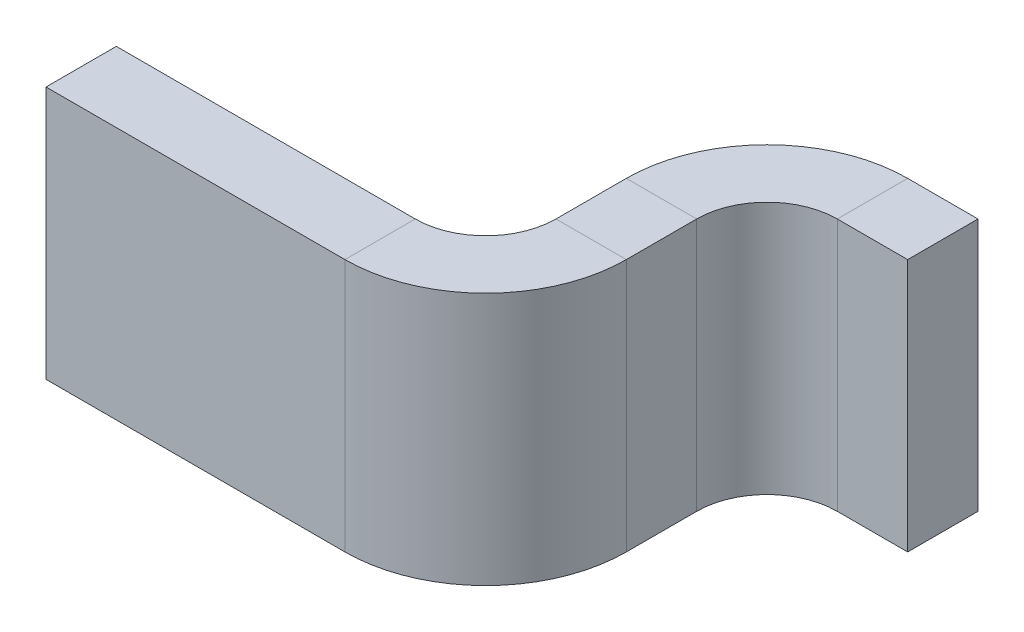
ISO-10303-21;
HEADER;
FILE_DESCRIPTION(('STEP AP214'),'2;1');
FILE_NAME('part.step','',(''),(''),'','','');
FILE_SCHEMA(('AUTOMOTIVE_DESIGN { 1 0 10303 214 1 1 1 1 }'));
ENDSEC;
DATA;
#1=APPLICATION_CONTEXT('core data for automotive mechanical design processes');
#2=APPLICATION_PROTOCOL_DEFINITION('international standard','automotive_design',2000,#1);
#3=PRODUCT_CONTEXT('',#1,'mechanical');
#4=PRODUCT('Part','Part','',(#3));
#5=PRODUCT_RELATED_PRODUCT_CATEGORY('part','',(#4));
#6=PRODUCT_DEFINITION_FORMATION('','',#4);
#7=PRODUCT_DEFINITION_CONTEXT('part definition',#1,'design');
#8=PRODUCT_DEFINITION('design','',#6,#7);
#9=PRODUCT_DEFINITION_SHAPE('','',#8);
#10=(LENGTH_UNIT() NAMED_UNIT(*) SI_UNIT(.MILLI.,.METRE.));
#11=(NAMED_UNIT(*) PLANE_ANGLE_UNIT() SI_UNIT($,.RADIAN.));
#12=(NAMED_UNIT(*) SI_UNIT($,.STERADIAN.) SOLID_ANGLE_UNIT());
#13=UNCERTAINTY_MEASURE_WITH_UNIT(LENGTH_MEASURE(1.E-05),#10,'distance_accuracy_value','');
#14=(GEOMETRIC_REPRESENTATION_CONTEXT(3) GLOBAL_UNCERTAINTY_ASSIGNED_CONTEXT((#13)) GLOBAL_UNIT_ASSIGNED_CONTEXT((#10,
#11,#12)) REPRESENTATION_CONTEXT('',''));
#15=CARTESIAN_POINT('',(0.,0.,0.));
#16=DIRECTION('',(0.,0.,1.));
#17=DIRECTION('',(1.,0.,0.));
#18=AXIS2_PLACEMENT_3D('',#15,#16,#17);
#19=CARTESIAN_POINT('',(1.65,-0.36,0.));
#20=DIRECTION('',(-1.,0.,0.));
#21=DIRECTION('',(0.,0.,1.));
#22=AXIS2_PLACEMENT_3D('',#19,#20,#21);
#23=PLANE('',#22);
#24=DIRECTION('',(0.,-1.,0.));
#25=VECTOR('',#24,1.);
#26=CARTESIAN_POINT('',(1.65,-0.36,0.));
#27=LINE('',#26,#25);
#28=CARTESIAN_POINT('',(1.65,0.36,0.));
#29=VERTEX_POINT('',#28);
#30=CARTESIAN_POINT('',(1.65,-0.36,0.));
#31=VERTEX_POINT('',#30);
#32=EDGE_CURVE('E185',#29,#31,#27,.T.);
#33=ORIENTED_EDGE('',*,*,#32,.F.);
#34=DIRECTION('',(0.,0.,-1.));
#35=VECTOR('',#34,1.);
#36=CARTESIAN_POINT('',(1.65,0.36,0.));
#37=LINE('',#36,#35);
#38=CARTESIAN_POINT('',(1.65,0.36,0.2));
#39=VERTEX_POINT('',#38);
#40=EDGE_CURVE('E11',#39,#29,#37,.T.);
#41=ORIENTED_EDGE('',*,*,#40,.F.);
#42=DIRECTION('',(0.,1.,0.));
#43=VECTOR('',#42,1.);
#44=CARTESIAN_POINT('',(1.65,0.36,0.2));
#45=LINE('',#44,#43);
#46=CARTESIAN_POINT('',(1.65,-0.36,0.2));
#47=VERTEX_POINT('',#46);
#48=EDGE_CURVE('E225',#47,#39,#45,.T.);
#49=ORIENTED_EDGE('',*,*,#48,.F.);
#50=DIRECTION('',(0.,0.,1.));
#51=VECTOR('',#50,1.);
#52=CARTESIAN_POINT('',(1.65,-0.36,0.2));
#53=LINE('',#52,#51);
#54=EDGE_CURVE('E198',#31,#47,#53,.T.);
#55=ORIENTED_EDGE('',*,*,#54,.F.);
#56=EDGE_LOOP('',(#33,#41,#49,#55));
#57=FACE_BOUND('',#56,.T.);
#58=ADVANCED_FACE('F16',(#57),#23,.F.);
#59=CARTESIAN_POINT('',(1.45,0.36,0.));
#60=DIRECTION('',(0.,-1.,0.));
#61=DIRECTION('',(0.,0.,-1.));
#62=AXIS2_PLACEMENT_3D('',#59,#60,#61);
#63=PLANE('',#62);
#64=ORIENTED_EDGE('',*,*,#40,.T.);
#65=DIRECTION('',(1.,0.,0.));
#66=VECTOR('',#65,1.);
#67=CARTESIAN_POINT('',(1.45,0.36,0.));
#68=LINE('',#67,#66);
#69=CARTESIAN_POINT('',(1.45,0.36,0.));
#70=VERTEX_POINT('',#69);
#71=EDGE_CURVE('E219',#70,#29,#68,.T.);
#72=ORIENTED_EDGE('',*,*,#71,.F.);
#73=DIRECTION('',(0.,0.,-1.));
#74=VECTOR('',#73,1.);
#75=CARTESIAN_POINT('',(1.45,0.36,0.));
#76=LINE('',#75,#74);
#77=CARTESIAN_POINT('',(1.45,0.36,0.2));
#78=VERTEX_POINT('',#77);
#79=EDGE_CURVE('E27',#78,#70,#76,.T.);
#80=ORIENTED_EDGE('',*,*,#79,.F.);
#81=DIRECTION('',(1.,0.,0.));
#82=VECTOR('',#81,1.);
#83=CARTESIAN_POINT('',(1.45,0.36,0.2));
#84=LINE('',#83,#82);
#85=EDGE_CURVE('E229',#78,#39,#84,.T.);
#86=ORIENTED_EDGE('',*,*,#85,.T.);
#87=EDGE_LOOP('',(#64,#72,#80,#86));
#88=FACE_BOUND('',#87,.T.);
#89=ADVANCED_FACE('F333',(#88),#63,.F.);
#90=CARTESIAN_POINT('',(1.237867965644,0.36,0.187867965644));
#91=DIRECTION('',(0.,1.,0.));
#92=DIRECTION('',(1.,0.,0.));
#93=AXIS2_PLACEMENT_3D('',#90,#91,#92);
#94=PLANE('',#93);
#95=CARTESIAN_POINT('',(1.45,0.36,0.4));
#96=DIRECTION('',(0.,-1.,0.));
#97=DIRECTION('',(0.,0.,-1.));
#98=AXIS2_PLACEMENT_3D('',#95,#96,#97);
#99=CIRCLE('',#98,0.2);
#100=CARTESIAN_POINT('',(1.25,0.36,0.4));
#101=VERTEX_POINT('',#100);
#102=EDGE_CURVE('E230',#101,#78,#99,.T.);
#103=ORIENTED_EDGE('',*,*,#102,.T.);
#104=ORIENTED_EDGE('',*,*,#79,.T.);
#105=CARTESIAN_POINT('',(1.45,0.36,0.4));
#106=DIRECTION('',(0.,-1.,0.));
#107=DIRECTION('',(0.,0.,-1.));
#108=AXIS2_PLACEMENT_3D('',#105,#106,#107);
#109=CIRCLE('',#108,0.4);
#110=CARTESIAN_POINT('',(1.05,0.36,0.4));
#111=VERTEX_POINT('',#110);
#112=EDGE_CURVE('E267',#111,#70,#109,.T.);
#113=ORIENTED_EDGE('',*,*,#112,.F.);
#114=DIRECTION('',(-1.,0.,0.));
#115=VECTOR('',#114,1.);
#116=CARTESIAN_POINT('',(1.05,0.36,0.4));
#117=LINE('',#116,#115);
#118=EDGE_CURVE('E115',#101,#111,#117,.T.);
#119=ORIENTED_EDGE('',*,*,#118,.F.);
#120=EDGE_LOOP('',(#103,#104,#113,#119));
#121=FACE_BOUND('',#120,.T.);
#122=ADVANCED_FACE('F334',(#121),#94,.T.);
#123=CARTESIAN_POINT('',(1.05,0.36,0.6));
#124=DIRECTION('',(0.,-1.,0.));
#125=DIRECTION('',(0.,0.,-1.));
#126=AXIS2_PLACEMENT_3D('',#123,#124,#125);
#127=PLANE('',#126);
#128=ORIENTED_EDGE('',*,*,#118,.T.);
#129=DIRECTION('',(0.,0.,-1.));
#130=VECTOR('',#129,1.);
#131=CARTESIAN_POINT('',(1.05,0.36,0.6));
#132=LINE('',#131,#130);
#133=CARTESIAN_POINT('',(1.05,0.36,0.6));
#134=VERTEX_POINT('',#133);
#135=EDGE_CURVE('E217',#134,#111,#132,.T.);
#136=ORIENTED_EDGE('',*,*,#135,.F.);
#137=DIRECTION('',(-1.,0.,0.));
#138=VECTOR('',#137,1.);
#139=CARTESIAN_POINT('',(1.05,0.36,0.6));
#140=LINE('',#139,#138);
#141=CARTESIAN_POINT('',(1.25,0.36,0.6));
#142=VERTEX_POINT('',#141);
#143=EDGE_CURVE('E125',#142,#134,#140,.T.);
#144=ORIENTED_EDGE('',*,*,#143,.F.);
#145=DIRECTION('',(0.,0.,-1.));
#146=VECTOR('',#145,1.);
#147=CARTESIAN_POINT('',(1.25,0.36,0.6));
#148=LINE('',#147,#146);
#149=EDGE_CURVE('E208',#142,#101,#148,.T.);
#150=ORIENTED_EDGE('',*,*,#149,.T.);
#151=EDGE_LOOP('',(#128,#136,#144,#150));
#152=FACE_BOUND('',#151,.T.);
#153=ADVANCED_FACE('F345',(#152),#127,.F.);
#154=CARTESIAN_POINT('',(1.062132034356,0.36,0.812132034356));
#155=DIRECTION('',(0.,1.,0.));
#156=DIRECTION('',(1.,0.,0.));
#157=AXIS2_PLACEMENT_3D('',#154,#155,#156);
#158=PLANE('',#157);
#159=CARTESIAN_POINT('',(0.85,0.36,0.6));
#160=DIRECTION('',(0.,1.,0.));
#161=DIRECTION('',(0.,0.,-1.));
#162=AXIS2_PLACEMENT_3D('',#159,#160,#161);
#163=CIRCLE('',#162,0.4);
#164=CARTESIAN_POINT('',(0.85,0.36,1.));
#165=VERTEX_POINT('',#164);
#166=EDGE_CURVE('E209',#165,#142,#163,.T.);
#167=ORIENTED_EDGE('',*,*,#166,.T.);
#168=ORIENTED_EDGE('',*,*,#143,.T.);
#169=CARTESIAN_POINT('',(0.85,0.36,0.6));
#170=DIRECTION('',(0.,1.,0.));
#171=DIRECTION('',(0.,0.,-1.));
#172=AXIS2_PLACEMENT_3D('',#169,#170,#171);
#173=CIRCLE('',#172,0.2);
#174=CARTESIAN_POINT('',(0.85,0.36,0.8));
#175=VERTEX_POINT('',#174);
#176=EDGE_CURVE('E251',#175,#134,#173,.T.);
#177=ORIENTED_EDGE('',*,*,#176,.F.);
#178=DIRECTION('',(0.,0.,-1.));
#179=VECTOR('',#178,1.);
#180=CARTESIAN_POINT('',(0.85,0.36,0.8));
#181=LINE('',#180,#179);
#182=EDGE_CURVE('E212',#165,#175,#181,.T.);
#183=ORIENTED_EDGE('',*,*,#182,.F.);
#184=EDGE_LOOP('',(#167,#168,#177,#183));
#185=FACE_BOUND('',#184,.T.);
#186=ADVANCED_FACE('F352',(#185),#158,.T.);
#187=CARTESIAN_POINT('',(0.,0.36,0.8));
#188=DIRECTION('',(0.,-1.,0.));
#189=DIRECTION('',(0.,0.,-1.));
#190=AXIS2_PLACEMENT_3D('',#187,#188,#189);
#191=PLANE('',#190);
#192=ORIENTED_EDGE('',*,*,#182,.T.);
#193=DIRECTION('',(1.,0.,0.));
#194=VECTOR('',#193,1.);
#195=CARTESIAN_POINT('',(0.,0.36,0.8));
#196=LINE('',#195,#194);
#197=CARTESIAN_POINT('',(0.,0.36,0.8));
#198=VERTEX_POINT('',#197);
#199=EDGE_CURVE('E167',#198,#175,#196,.T.);
#200=ORIENTED_EDGE('',*,*,#199,.F.);
#201=DIRECTION('',(0.,0.,-1.));
#202=VECTOR('',#201,1.);
#203=CARTESIAN_POINT('',(0.,0.36,0.8));
#204=LINE('',#203,#202);
#205=CARTESIAN_POINT('',(0.,0.36,1.));
#206=VERTEX_POINT('',#205);
#207=EDGE_CURVE('E164',#206,#198,#204,.T.);
#208=ORIENTED_EDGE('',*,*,#207,.F.);
#209=DIRECTION('',(1.,0.,0.));
#210=VECTOR('',#209,1.);
#211=CARTESIAN_POINT('',(0.,0.36,1.));
#212=LINE('',#211,#210);
#213=EDGE_CURVE('E150',#206,#165,#212,.T.);
#214=ORIENTED_EDGE('',*,*,#213,.T.);
#215=EDGE_LOOP('',(#192,#200,#208,#214));
#216=FACE_BOUND('',#215,.T.);
#217=ADVANCED_FACE('F165',(#216),#191,.F.);
#218=CARTESIAN_POINT('',(1.45,0.36,0.2));
#219=DIRECTION('',(0.,0.,-1.));
#220=DIRECTION('',(0.,-1.,0.));
#221=AXIS2_PLACEMENT_3D('',#218,#219,#220);
#222=PLANE('',#221);
#223=ORIENTED_EDGE('',*,*,#48,.T.);
#224=ORIENTED_EDGE('',*,*,#85,.F.);
#225=DIRECTION('',(0.,-1.,0.));
#226=VECTOR('',#225,1.);
#227=CARTESIAN_POINT('',(1.45,0.36,0.2));
#228=LINE('',#227,#226);
#229=CARTESIAN_POINT('',(1.45,-0.36,0.2));
#230=VERTEX_POINT('',#229);
#231=EDGE_CURVE('E273',#78,#230,#228,.T.);
#232=ORIENTED_EDGE('',*,*,#231,.T.);
#233=DIRECTION('',(1.,0.,0.));
#234=VECTOR('',#233,1.);
#235=CARTESIAN_POINT('',(1.45,-0.36,0.2));
#236=LINE('',#235,#234);
#237=EDGE_CURVE('E202',#230,#47,#236,.T.);
#238=ORIENTED_EDGE('',*,*,#237,.T.);
#239=EDGE_LOOP('',(#223,#224,#232,#238));
#240=FACE_BOUND('',#239,.T.);
#241=ADVANCED_FACE('F323',(#240),#222,.F.);
#242=CARTESIAN_POINT('',(1.45,0.36,0.4));
#243=DIRECTION('',(0.,-1.,0.));
#244=DIRECTION('',(0.,0.,-1.));
#245=AXIS2_PLACEMENT_3D('',#242,#243,#244);
#246=CYLINDRICAL_SURFACE('',#245,0.2);
#247=ORIENTED_EDGE('',*,*,#231,.F.);
#248=ORIENTED_EDGE('',*,*,#102,.F.);
#249=DIRECTION('',(0.,1.,0.));
#250=VECTOR('',#249,1.);
#251=CARTESIAN_POINT('',(1.25,0.36,0.4));
#252=LINE('',#251,#250);
#253=CARTESIAN_POINT('',(1.25,-0.36,0.4));
#254=VERTEX_POINT('',#253);
#255=EDGE_CURVE('E204',#254,#101,#252,.T.);
#256=ORIENTED_EDGE('',*,*,#255,.F.);
#257=CARTESIAN_POINT('',(1.45,-0.36,0.4));
#258=DIRECTION('',(0.,-1.,0.));
#259=DIRECTION('',(0.,0.,-1.));
#260=AXIS2_PLACEMENT_3D('',#257,#258,#259);
#261=CIRCLE('',#260,0.2);
#262=EDGE_CURVE('E203',#254,#230,#261,.T.);
#263=ORIENTED_EDGE('',*,*,#262,.T.);
#264=EDGE_LOOP('',(#247,#248,#256,#263));
#265=FACE_BOUND('',#264,.T.);
#266=ADVANCED_FACE('F336',(#265),#246,.F.);
#267=CARTESIAN_POINT('',(1.25,0.36,0.6));
#268=DIRECTION('',(-1.,0.,0.));
#269=DIRECTION('',(0.,0.,1.));
#270=AXIS2_PLACEMENT_3D('',#267,#268,#269);
#271=PLANE('',#270);
#272=ORIENTED_EDGE('',*,*,#255,.T.);
#273=ORIENTED_EDGE('',*,*,#149,.F.);
#274=DIRECTION('',(0.,1.,0.));
#275=VECTOR('',#274,1.);
#276=CARTESIAN_POINT('',(1.25,0.36,0.6));
#277=LINE('',#276,#275);
#278=CARTESIAN_POINT('',(1.25,-0.36,0.6));
#279=VERTEX_POINT('',#278);
#280=EDGE_CURVE('E161',#279,#142,#277,.T.);
#281=ORIENTED_EDGE('',*,*,#280,.F.);
#282=DIRECTION('',(0.,0.,-1.));
#283=VECTOR('',#282,1.);
#284=CARTESIAN_POINT('',(1.25,-0.36,0.6));
#285=LINE('',#284,#283);
#286=EDGE_CURVE('E237',#279,#254,#285,.T.);
#287=ORIENTED_EDGE('',*,*,#286,.T.);
#288=EDGE_LOOP('',(#272,#273,#281,#287));
#289=FACE_BOUND('',#288,.T.);
#290=ADVANCED_FACE('F18',(#289),#271,.F.);
#291=CARTESIAN_POINT('',(0.85,0.36,0.6));
#292=DIRECTION('',(0.,1.,0.));
#293=DIRECTION('',(0.,0.,-1.));
#294=AXIS2_PLACEMENT_3D('',#291,#292,#293);
#295=CYLINDRICAL_SURFACE('',#294,0.4);
#296=CARTESIAN_POINT('',(0.85,-0.36,0.6));
#297=DIRECTION('',(0.,1.,0.));
#298=DIRECTION('',(0.,0.,-1.));
#299=AXIS2_PLACEMENT_3D('',#296,#297,#298);
#300=CIRCLE('',#299,0.4);
#301=CARTESIAN_POINT('',(0.85,-0.36,1.));
#302=VERTEX_POINT('',#301);
#303=EDGE_CURVE('E191',#302,#279,#300,.T.);
#304=ORIENTED_EDGE('',*,*,#303,.T.);
#305=ORIENTED_EDGE('',*,*,#280,.T.);
#306=ORIENTED_EDGE('',*,*,#166,.F.);
#307=DIRECTION('',(0.,1.,0.));
#308=VECTOR('',#307,1.);
#309=CARTESIAN_POINT('',(0.85,0.36,1.));
#310=LINE('',#309,#308);
#311=EDGE_CURVE('E157',#302,#165,#310,.T.);
#312=ORIENTED_EDGE('',*,*,#311,.F.);
#313=EDGE_LOOP('',(#304,#305,#306,#312));
#314=FACE_BOUND('',#313,.T.);
#315=ADVANCED_FACE('F362',(#314),#295,.T.);
#316=CARTESIAN_POINT('',(0.,0.36,1.));
#317=DIRECTION('',(0.,0.,-1.));
#318=DIRECTION('',(0.,-1.,0.));
#319=AXIS2_PLACEMENT_3D('',#316,#317,#318);
#320=PLANE('',#319);
#321=ORIENTED_EDGE('',*,*,#311,.T.);
#322=ORIENTED_EDGE('',*,*,#213,.F.);
#323=DIRECTION('',(0.,1.,0.));
#324=VECTOR('',#323,1.);
#325=CARTESIAN_POINT('',(0.,0.36,1.));
#326=LINE('',#325,#324);
#327=CARTESIAN_POINT('',(0.,-0.36,1.));
#328=VERTEX_POINT('',#327);
#329=EDGE_CURVE('E155',#328,#206,#326,.T.);
#330=ORIENTED_EDGE('',*,*,#329,.F.);
#331=DIRECTION('',(1.,0.,0.));
#332=VECTOR('',#331,1.);
#333=CARTESIAN_POINT('',(0.,-0.36,1.));
#334=LINE('',#333,#332);
#335=EDGE_CURVE('E192',#328,#302,#334,.T.);
#336=ORIENTED_EDGE('',*,*,#335,.T.);
#337=EDGE_LOOP('',(#321,#322,#330,#336));
#338=FACE_BOUND('',#337,.T.);
#339=ADVANCED_FACE('F152',(#338),#320,.F.);
#340=CARTESIAN_POINT('',(1.45,-0.36,0.2));
#341=DIRECTION('',(0.,1.,0.));
#342=DIRECTION('',(1.,0.,0.));
#343=AXIS2_PLACEMENT_3D('',#340,#341,#342);
#344=PLANE('',#343);
#345=ORIENTED_EDGE('',*,*,#54,.T.);
#346=ORIENTED_EDGE('',*,*,#237,.F.);
#347=DIRECTION('',(0.,0.,1.));
#348=VECTOR('',#347,1.);
#349=CARTESIAN_POINT('',(1.45,-0.36,0.2));
#350=LINE('',#349,#348);
#351=CARTESIAN_POINT('',(1.45,-0.36,0.));
#352=VERTEX_POINT('',#351);
#353=EDGE_CURVE('E233',#352,#230,#350,.T.);
#354=ORIENTED_EDGE('',*,*,#353,.F.);
#355=DIRECTION('',(1.,0.,0.));
#356=VECTOR('',#355,1.);
#357=CARTESIAN_POINT('',(1.45,-0.36,0.));
#358=LINE('',#357,#356);
#359=EDGE_CURVE('E224',#352,#31,#358,.T.);
#360=ORIENTED_EDGE('',*,*,#359,.T.);
#361=EDGE_LOOP('',(#345,#346,#354,#360));
#362=FACE_BOUND('',#361,.T.);
#363=ADVANCED_FACE('F327',(#362),#344,.F.);
#364=CARTESIAN_POINT('',(1.237867965644,-0.36,0.187867965644));
#365=DIRECTION('',(0.,-1.,0.));
#366=DIRECTION('',(0.,0.,-1.));
#367=AXIS2_PLACEMENT_3D('',#364,#365,#366);
#368=PLANE('',#367);
#369=CARTESIAN_POINT('',(1.45,-0.36,0.4));
#370=DIRECTION('',(0.,-1.,0.));
#371=DIRECTION('',(0.,0.,-1.));
#372=AXIS2_PLACEMENT_3D('',#369,#370,#371);
#373=CIRCLE('',#372,0.4);
#374=CARTESIAN_POINT('',(1.05,-0.36,0.4));
#375=VERTEX_POINT('',#374);
#376=EDGE_CURVE('E183',#375,#352,#373,.T.);
#377=ORIENTED_EDGE('',*,*,#376,.T.);
#378=ORIENTED_EDGE('',*,*,#353,.T.);
#379=ORIENTED_EDGE('',*,*,#262,.F.);
#380=DIRECTION('',(1.,0.,0.));
#381=VECTOR('',#380,1.);
#382=CARTESIAN_POINT('',(1.25,-0.36,0.4));
#383=LINE('',#382,#381);
#384=EDGE_CURVE('E102',#375,#254,#383,.T.);
#385=ORIENTED_EDGE('',*,*,#384,.F.);
#386=EDGE_LOOP('',(#377,#378,#379,#385));
#387=FACE_BOUND('',#386,.T.);
#388=ADVANCED_FACE('F337',(#387),#368,.T.);
#389=CARTESIAN_POINT('',(1.25,-0.36,0.6));
#390=DIRECTION('',(0.,1.,0.));
#391=DIRECTION('',(1.,0.,0.));
#392=AXIS2_PLACEMENT_3D('',#389,#390,#391);
#393=PLANE('',#392);
#394=ORIENTED_EDGE('',*,*,#384,.T.);
#395=ORIENTED_EDGE('',*,*,#286,.F.);
#396=DIRECTION('',(1.,0.,0.));
#397=VECTOR('',#396,1.);
#398=CARTESIAN_POINT('',(1.25,-0.36,0.6));
#399=LINE('',#398,#397);
#400=CARTESIAN_POINT('',(1.05,-0.36,0.6));
#401=VERTEX_POINT('',#400);
#402=EDGE_CURVE('E187',#401,#279,#399,.T.);
#403=ORIENTED_EDGE('',*,*,#402,.F.);
#404=DIRECTION('',(0.,0.,-1.));
#405=VECTOR('',#404,1.);
#406=CARTESIAN_POINT('',(1.05,-0.36,0.6));
#407=LINE('',#406,#405);
#408=EDGE_CURVE('E213',#401,#375,#407,.T.);
#409=ORIENTED_EDGE('',*,*,#408,.T.);
#410=EDGE_LOOP('',(#394,#395,#403,#409));
#411=FACE_BOUND('',#410,.T.);
#412=ADVANCED_FACE('F360',(#411),#393,.F.);
#413=CARTESIAN_POINT('',(1.062132034356,-0.36,0.812132034356));
#414=DIRECTION('',(0.,-1.,0.));
#415=DIRECTION('',(0.,0.,-1.));
#416=AXIS2_PLACEMENT_3D('',#413,#414,#415);
#417=PLANE('',#416);
#418=CARTESIAN_POINT('',(0.85,-0.36,0.6));
#419=DIRECTION('',(0.,1.,0.));
#420=DIRECTION('',(0.,0.,-1.));
#421=AXIS2_PLACEMENT_3D('',#418,#419,#420);
#422=CIRCLE('',#421,0.2);
#423=CARTESIAN_POINT('',(0.85,-0.36,0.8));
#424=VERTEX_POINT('',#423);
#425=EDGE_CURVE('E245',#424,#401,#422,.T.);
#426=ORIENTED_EDGE('',*,*,#425,.T.);
#427=ORIENTED_EDGE('',*,*,#402,.T.);
#428=ORIENTED_EDGE('',*,*,#303,.F.);
#429=DIRECTION('',(0.,0.,1.));
#430=VECTOR('',#429,1.);
#431=CARTESIAN_POINT('',(0.85,-0.36,1.));
#432=LINE('',#431,#430);
#433=EDGE_CURVE('E223',#424,#302,#432,.T.);
#434=ORIENTED_EDGE('',*,*,#433,.F.);
#435=EDGE_LOOP('',(#426,#427,#428,#434));
#436=FACE_BOUND('',#435,.T.);
#437=ADVANCED_FACE('F359',(#436),#417,.T.);
#438=CARTESIAN_POINT('',(0.,-0.36,1.));
#439=DIRECTION('',(0.,1.,0.));
#440=DIRECTION('',(1.,0.,0.));
#441=AXIS2_PLACEMENT_3D('',#438,#439,#440);
#442=PLANE('',#441);
#443=ORIENTED_EDGE('',*,*,#433,.T.);
#444=ORIENTED_EDGE('',*,*,#335,.F.);
#445=DIRECTION('',(0.,0.,1.));
#446=VECTOR('',#445,1.);
#447=CARTESIAN_POINT('',(0.,-0.36,1.));
#448=LINE('',#447,#446);
#449=CARTESIAN_POINT('',(0.,-0.36,0.8));
#450=VERTEX_POINT('',#449);
#451=EDGE_CURVE('E20',#450,#328,#448,.T.);
#452=ORIENTED_EDGE('',*,*,#451,.F.);
#453=DIRECTION('',(1.,0.,0.));
#454=VECTOR('',#453,1.);
#455=CARTESIAN_POINT('',(0.,-0.36,0.8));
#456=LINE('',#455,#454);
#457=EDGE_CURVE('E197',#450,#424,#456,.T.);
#458=ORIENTED_EDGE('',*,*,#457,.T.);
#459=EDGE_LOOP('',(#443,#444,#452,#458));
#460=FACE_BOUND('',#459,.T.);
#461=ADVANCED_FACE('F357',(#460),#442,.F.);
#462=CARTESIAN_POINT('',(1.45,-0.36,0.));
#463=DIRECTION('',(0.,0.,1.));
#464=DIRECTION('',(1.,0.,0.));
#465=AXIS2_PLACEMENT_3D('',#462,#463,#464);
#466=PLANE('',#465);
#467=ORIENTED_EDGE('',*,*,#32,.T.);
#468=ORIENTED_EDGE('',*,*,#359,.F.);
#469=DIRECTION('',(0.,-1.,0.));
#470=VECTOR('',#469,1.);
#471=CARTESIAN_POINT('',(1.45,-0.36,0.));
#472=LINE('',#471,#470);
#473=EDGE_CURVE('E186',#70,#352,#472,.T.);
#474=ORIENTED_EDGE('',*,*,#473,.F.);
#475=ORIENTED_EDGE('',*,*,#71,.T.);
#476=EDGE_LOOP('',(#467,#468,#474,#475));
#477=FACE_BOUND('',#476,.T.);
#478=ADVANCED_FACE('F330',(#477),#466,.F.);
#479=CARTESIAN_POINT('',(1.45,-0.36,0.4));
#480=DIRECTION('',(0.,-1.,0.));
#481=DIRECTION('',(0.,0.,-1.));
#482=AXIS2_PLACEMENT_3D('',#479,#480,#481);
#483=CYLINDRICAL_SURFACE('',#482,0.4);
#484=ORIENTED_EDGE('',*,*,#112,.T.);
#485=ORIENTED_EDGE('',*,*,#473,.T.);
#486=ORIENTED_EDGE('',*,*,#376,.F.);
#487=DIRECTION('',(0.,-1.,0.));
#488=VECTOR('',#487,1.);
#489=CARTESIAN_POINT('',(1.05,-0.36,0.4));
#490=LINE('',#489,#488);
#491=EDGE_CURVE('E218',#111,#375,#490,.T.);
#492=ORIENTED_EDGE('',*,*,#491,.F.);
#493=EDGE_LOOP('',(#484,#485,#486,#492));
#494=FACE_BOUND('',#493,.T.);
#495=ADVANCED_FACE('F340',(#494),#483,.T.);
#496=CARTESIAN_POINT('',(1.05,-0.36,0.6));
#497=DIRECTION('',(1.,0.,0.));
#498=DIRECTION('',(0.,1.,0.));
#499=AXIS2_PLACEMENT_3D('',#496,#497,#498);
#500=PLANE('',#499);
#501=ORIENTED_EDGE('',*,*,#491,.T.);
#502=ORIENTED_EDGE('',*,*,#408,.F.);
#503=DIRECTION('',(0.,1.,0.));
#504=VECTOR('',#503,1.);
#505=CARTESIAN_POINT('',(1.05,-0.36,0.6));
#506=LINE('',#505,#504);
#507=EDGE_CURVE('E241',#401,#134,#506,.T.);
#508=ORIENTED_EDGE('',*,*,#507,.T.);
#509=ORIENTED_EDGE('',*,*,#135,.T.);
#510=EDGE_LOOP('',(#501,#502,#508,#509));
#511=FACE_BOUND('',#510,.T.);
#512=ADVANCED_FACE('F342',(#511),#500,.F.);
#513=CARTESIAN_POINT('',(0.85,-0.36,0.6));
#514=DIRECTION('',(0.,1.,0.));
#515=DIRECTION('',(0.,0.,-1.));
#516=AXIS2_PLACEMENT_3D('',#513,#514,#515);
#517=CYLINDRICAL_SURFACE('',#516,0.2);
#518=ORIENTED_EDGE('',*,*,#507,.F.);
#519=ORIENTED_EDGE('',*,*,#425,.F.);
#520=DIRECTION('',(0.,-1.,0.));
#521=VECTOR('',#520,1.);
#522=CARTESIAN_POINT('',(0.85,-0.36,0.8));
#523=LINE('',#522,#521);
#524=EDGE_CURVE('E193',#175,#424,#523,.T.);
#525=ORIENTED_EDGE('',*,*,#524,.F.);
#526=ORIENTED_EDGE('',*,*,#176,.T.);
#527=EDGE_LOOP('',(#518,#519,#525,#526));
#528=FACE_BOUND('',#527,.T.);
#529=ADVANCED_FACE('F349',(#528),#517,.F.);
#530=CARTESIAN_POINT('',(0.,-0.36,0.8));
#531=DIRECTION('',(0.,0.,1.));
#532=DIRECTION('',(1.,0.,0.));
#533=AXIS2_PLACEMENT_3D('',#530,#531,#532);
#534=PLANE('',#533);
#535=ORIENTED_EDGE('',*,*,#524,.T.);
#536=ORIENTED_EDGE('',*,*,#457,.F.);
#537=DIRECTION('',(0.,-1.,0.));
#538=VECTOR('',#537,1.);
#539=CARTESIAN_POINT('',(0.,-0.36,0.8));
#540=LINE('',#539,#538);
#541=EDGE_CURVE('E172',#198,#450,#540,.T.);
#542=ORIENTED_EDGE('',*,*,#541,.F.);
#543=ORIENTED_EDGE('',*,*,#199,.T.);
#544=EDGE_LOOP('',(#535,#536,#542,#543));
#545=FACE_BOUND('',#544,.T.);
#546=ADVANCED_FACE('F355',(#545),#534,.F.);
#547=CARTESIAN_POINT('',(0.,-0.36,0.8));
#548=DIRECTION('',(-1.,0.,0.));
#549=DIRECTION('',(0.,0.,1.));
#550=AXIS2_PLACEMENT_3D('',#547,#548,#549);
#551=PLANE('',#550);
#552=ORIENTED_EDGE('',*,*,#451,.T.);
#553=ORIENTED_EDGE('',*,*,#329,.T.);
#554=ORIENTED_EDGE('',*,*,#207,.T.);
#555=ORIENTED_EDGE('',*,*,#541,.T.);
#556=EDGE_LOOP('',(#552,#553,#554,#555));
#557=FACE_BOUND('',#556,.T.);
#558=ADVANCED_FACE('F174',(#557),#551,.T.);
#559=CLOSED_SHELL('',(#58,#89,#122,#153,#186,#217,#241,#266,#290,#315,#339,#363,#388,#412,#437,
#461,#478,#495,#512,#529,#546,#558));
#560=MANIFOLD_SOLID_BREP('B1',#559);
#561=ADVANCED_BREP_SHAPE_REPRESENTATION('',(#18,#560),#14);
#562=SHAPE_DEFINITION_REPRESENTATION(#9,#561);
ENDSEC;
END-ISO-10303-21;
